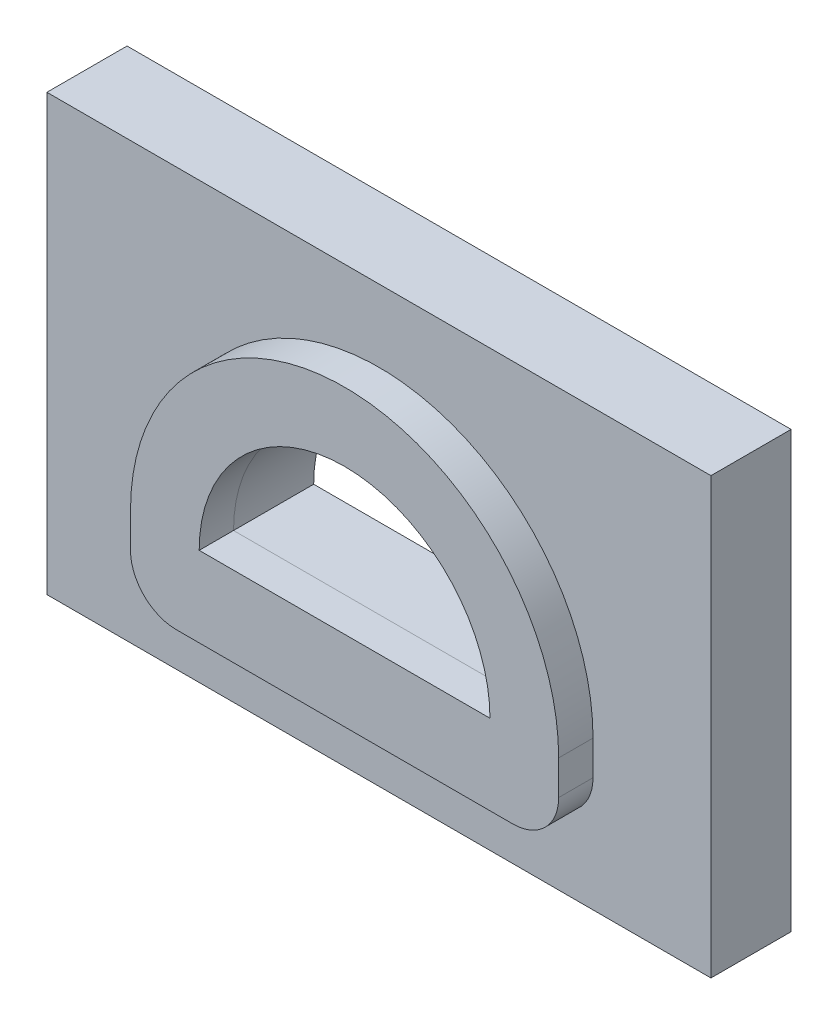
ISO-10303-21;
HEADER;
FILE_DESCRIPTION(('STEP AP214'),'2;1');
FILE_NAME('part.step','',(''),(''),'','','');
FILE_SCHEMA(('AUTOMOTIVE_DESIGN { 1 0 10303 214 1 1 1 1 }'));
ENDSEC;
DATA;
#1=APPLICATION_CONTEXT('core data for automotive mechanical design processes');
#2=APPLICATION_PROTOCOL_DEFINITION('international standard','automotive_design',2000,#1);
#3=PRODUCT_CONTEXT('',#1,'mechanical');
#4=PRODUCT('Part','Part','',(#3));
#5=PRODUCT_RELATED_PRODUCT_CATEGORY('part','',(#4));
#6=PRODUCT_DEFINITION_FORMATION('','',#4);
#7=PRODUCT_DEFINITION_CONTEXT('part definition',#1,'design');
#8=PRODUCT_DEFINITION('design','',#6,#7);
#9=PRODUCT_DEFINITION_SHAPE('','',#8);
#10=(LENGTH_UNIT() NAMED_UNIT(*) SI_UNIT(.MILLI.,.METRE.));
#11=(NAMED_UNIT(*) PLANE_ANGLE_UNIT() SI_UNIT($,.RADIAN.));
#12=(NAMED_UNIT(*) SI_UNIT($,.STERADIAN.) SOLID_ANGLE_UNIT());
#13=UNCERTAINTY_MEASURE_WITH_UNIT(LENGTH_MEASURE(1.E-05),#10,'distance_accuracy_value','');
#14=(GEOMETRIC_REPRESENTATION_CONTEXT(3) GLOBAL_UNCERTAINTY_ASSIGNED_CONTEXT((#13)) GLOBAL_UNIT_ASSIGNED_CONTEXT((#10,
#11,#12)) REPRESENTATION_CONTEXT('',''));
#15=CARTESIAN_POINT('',(0.,0.,0.));
#16=DIRECTION('',(0.,0.,1.));
#17=DIRECTION('',(1.,0.,0.));
#18=AXIS2_PLACEMENT_3D('',#15,#16,#17);
#19=CARTESIAN_POINT('',(2.15,0.,-3.5));
#20=DIRECTION('',(0.,0.,1.));
#21=DIRECTION('',(1.,0.,0.));
#22=AXIS2_PLACEMENT_3D('',#19,#20,#21);
#23=CYLINDRICAL_SURFACE('',#22,6.35);
#24=CARTESIAN_POINT('',(2.15,0.,0.));
#25=DIRECTION('',(0.,0.,1.));
#26=DIRECTION('',(1.,0.,0.));
#27=AXIS2_PLACEMENT_3D('',#24,#25,#26);
#28=CIRCLE('',#27,6.35);
#29=CARTESIAN_POINT('',(8.5,0.,0.));
#30=VERTEX_POINT('',#29);
#31=CARTESIAN_POINT('',(-4.2,0.,0.));
#32=VERTEX_POINT('',#31);
#33=EDGE_CURVE('E140',#30,#32,#28,.T.);
#34=ORIENTED_EDGE('',*,*,#33,.T.);
#35=DIRECTION('',(0.,0.,1.));
#36=VECTOR('',#35,1.);
#37=CARTESIAN_POINT('',(-4.2,0.,-3.5));
#38=LINE('',#37,#36);
#39=CARTESIAN_POINT('',(-4.2,0.,-3.5));
#40=VERTEX_POINT('',#39);
#41=EDGE_CURVE('E12',#40,#32,#38,.T.);
#42=ORIENTED_EDGE('',*,*,#41,.F.);
#43=CARTESIAN_POINT('',(2.15,0.,-3.5));
#44=DIRECTION('',(0.,0.,1.));
#45=DIRECTION('',(1.,0.,0.));
#46=AXIS2_PLACEMENT_3D('',#43,#44,#45);
#47=CIRCLE('',#46,6.35);
#48=CARTESIAN_POINT('',(8.5,0.,-3.5));
#49=VERTEX_POINT('',#48);
#50=EDGE_CURVE('E124',#49,#40,#47,.T.);
#51=ORIENTED_EDGE('',*,*,#50,.F.);
#52=DIRECTION('',(0.,0.,1.));
#53=VECTOR('',#52,1.);
#54=CARTESIAN_POINT('',(8.5,0.,-3.5));
#55=LINE('',#54,#53);
#56=EDGE_CURVE('E55',#49,#30,#55,.T.);
#57=ORIENTED_EDGE('',*,*,#56,.T.);
#58=EDGE_LOOP('',(#34,#42,#51,#57));
#59=FACE_BOUND('',#58,.T.);
#60=ADVANCED_FACE('F45',(#59),#23,.F.);
#61=CARTESIAN_POINT('',(16.65,0.,-3.5));
#62=DIRECTION('',(-1.,0.,0.));
#63=DIRECTION('',(0.,-1.,0.));
#64=AXIS2_PLACEMENT_3D('',#61,#62,#63);
#65=PLANE('',#64);
#66=DIRECTION('',(0.,-1.,0.));
#67=VECTOR('',#66,1.);
#68=CARTESIAN_POINT('',(16.65,0.,0.));
#69=LINE('',#68,#67);
#70=CARTESIAN_POINT('',(16.65,12.5,0.));
#71=VERTEX_POINT('',#70);
#72=CARTESIAN_POINT('',(16.65,-6.5,0.));
#73=VERTEX_POINT('',#72);
#74=EDGE_CURVE('E116',#71,#73,#69,.T.);
#75=ORIENTED_EDGE('',*,*,#74,.T.);
#76=DIRECTION('',(0.,0.,1.));
#77=VECTOR('',#76,1.);
#78=CARTESIAN_POINT('',(16.65,-6.5,-3.5));
#79=LINE('',#78,#77);
#80=CARTESIAN_POINT('',(16.65,-6.5,-3.5));
#81=VERTEX_POINT('',#80);
#82=EDGE_CURVE('E114',#81,#73,#79,.T.);
#83=ORIENTED_EDGE('',*,*,#82,.F.);
#84=DIRECTION('',(0.,-1.,0.));
#85=VECTOR('',#84,1.);
#86=CARTESIAN_POINT('',(16.65,0.,-3.5));
#87=LINE('',#86,#85);
#88=CARTESIAN_POINT('',(16.65,12.5,-3.5));
#89=VERTEX_POINT('',#88);
#90=EDGE_CURVE('E104',#89,#81,#87,.T.);
#91=ORIENTED_EDGE('',*,*,#90,.F.);
#92=DIRECTION('',(0.,0.,1.));
#93=VECTOR('',#92,1.);
#94=CARTESIAN_POINT('',(16.65,12.5,-3.5));
#95=LINE('',#94,#93);
#96=EDGE_CURVE('E49',#89,#71,#95,.T.);
#97=ORIENTED_EDGE('',*,*,#96,.T.);
#98=EDGE_LOOP('',(#75,#83,#91,#97));
#99=FACE_BOUND('',#98,.T.);
#100=ADVANCED_FACE('F47',(#99),#65,.F.);
#101=CARTESIAN_POINT('',(0.,-6.5,-3.5));
#102=DIRECTION('',(0.,-1.,0.));
#103=DIRECTION('',(1.,0.,0.));
#104=AXIS2_PLACEMENT_3D('',#101,#102,#103);
#105=PLANE('',#104);
#106=DIRECTION('',(1.,0.,0.));
#107=VECTOR('',#106,1.);
#108=CARTESIAN_POINT('',(0.,-6.5,0.));
#109=LINE('',#108,#107);
#110=CARTESIAN_POINT('',(-12.35,-6.5,0.));
#111=VERTEX_POINT('',#110);
#112=EDGE_CURVE('E138',#111,#73,#109,.T.);
#113=ORIENTED_EDGE('',*,*,#112,.F.);
#114=DIRECTION('',(0.,0.,1.));
#115=VECTOR('',#114,1.);
#116=CARTESIAN_POINT('',(-12.35,-6.5,-3.5));
#117=LINE('',#116,#115);
#118=CARTESIAN_POINT('',(-12.35,-6.5,-3.5));
#119=VERTEX_POINT('',#118);
#120=EDGE_CURVE('E120',#119,#111,#117,.T.);
#121=ORIENTED_EDGE('',*,*,#120,.F.);
#122=DIRECTION('',(1.,0.,0.));
#123=VECTOR('',#122,1.);
#124=CARTESIAN_POINT('',(0.,-6.5,-3.5));
#125=LINE('',#124,#123);
#126=EDGE_CURVE('E109',#119,#81,#125,.T.);
#127=ORIENTED_EDGE('',*,*,#126,.T.);
#128=ORIENTED_EDGE('',*,*,#82,.T.);
#129=EDGE_LOOP('',(#113,#121,#127,#128));
#130=FACE_BOUND('',#129,.T.);
#131=ADVANCED_FACE('F122',(#130),#105,.T.);
#132=CARTESIAN_POINT('',(-12.35,0.,-3.5));
#133=DIRECTION('',(-1.,0.,0.));
#134=DIRECTION('',(0.,-1.,0.));
#135=AXIS2_PLACEMENT_3D('',#132,#133,#134);
#136=PLANE('',#135);
#137=DIRECTION('',(0.,-1.,0.));
#138=VECTOR('',#137,1.);
#139=CARTESIAN_POINT('',(-12.35,0.,0.));
#140=LINE('',#139,#138);
#141=CARTESIAN_POINT('',(-12.35,12.5,0.));
#142=VERTEX_POINT('',#141);
#143=EDGE_CURVE('E135',#142,#111,#140,.T.);
#144=ORIENTED_EDGE('',*,*,#143,.F.);
#145=DIRECTION('',(0.,0.,1.));
#146=VECTOR('',#145,1.);
#147=CARTESIAN_POINT('',(-12.35,12.5,-3.5));
#148=LINE('',#147,#146);
#149=CARTESIAN_POINT('',(-12.35,12.5,-3.5));
#150=VERTEX_POINT('',#149);
#151=EDGE_CURVE('E145',#150,#142,#148,.T.);
#152=ORIENTED_EDGE('',*,*,#151,.F.);
#153=DIRECTION('',(0.,-1.,0.));
#154=VECTOR('',#153,1.);
#155=CARTESIAN_POINT('',(-12.35,0.,-3.5));
#156=LINE('',#155,#154);
#157=EDGE_CURVE('E125',#150,#119,#156,.T.);
#158=ORIENTED_EDGE('',*,*,#157,.T.);
#159=ORIENTED_EDGE('',*,*,#120,.T.);
#160=EDGE_LOOP('',(#144,#152,#158,#159));
#161=FACE_BOUND('',#160,.T.);
#162=ADVANCED_FACE('F152',(#161),#136,.T.);
#163=CARTESIAN_POINT('',(0.,12.5,-3.5));
#164=DIRECTION('',(0.,-1.,0.));
#165=DIRECTION('',(0.,0.,-1.));
#166=AXIS2_PLACEMENT_3D('',#163,#164,#165);
#167=PLANE('',#166);
#168=DIRECTION('',(1.,0.,0.));
#169=VECTOR('',#168,1.);
#170=CARTESIAN_POINT('',(0.,12.5,0.));
#171=LINE('',#170,#169);
#172=EDGE_CURVE('E133',#142,#71,#171,.T.);
#173=ORIENTED_EDGE('',*,*,#172,.T.);
#174=ORIENTED_EDGE('',*,*,#96,.F.);
#175=DIRECTION('',(1.,0.,0.));
#176=VECTOR('',#175,1.);
#177=CARTESIAN_POINT('',(0.,12.5,-3.5));
#178=LINE('',#177,#176);
#179=EDGE_CURVE('E95',#150,#89,#178,.T.);
#180=ORIENTED_EDGE('',*,*,#179,.F.);
#181=ORIENTED_EDGE('',*,*,#151,.T.);
#182=EDGE_LOOP('',(#173,#174,#180,#181));
#183=FACE_BOUND('',#182,.T.);
#184=ADVANCED_FACE('F153',(#183),#167,.F.);
#185=CARTESIAN_POINT('',(0.,0.,-3.5));
#186=DIRECTION('',(0.,-1.,0.));
#187=DIRECTION('',(0.,0.,-1.));
#188=AXIS2_PLACEMENT_3D('',#185,#186,#187);
#189=PLANE('',#188);
#190=DIRECTION('',(1.,0.,0.));
#191=VECTOR('',#190,1.);
#192=CARTESIAN_POINT('',(0.,0.,0.));
#193=LINE('',#192,#191);
#194=EDGE_CURVE('E83',#32,#30,#193,.T.);
#195=ORIENTED_EDGE('',*,*,#194,.T.);
#196=ORIENTED_EDGE('',*,*,#56,.F.);
#197=DIRECTION('',(1.,0.,0.));
#198=VECTOR('',#197,1.);
#199=CARTESIAN_POINT('',(0.,0.,-3.5));
#200=LINE('',#199,#198);
#201=EDGE_CURVE('E63',#40,#49,#200,.T.);
#202=ORIENTED_EDGE('',*,*,#201,.F.);
#203=ORIENTED_EDGE('',*,*,#41,.T.);
#204=EDGE_LOOP('',(#195,#196,#202,#203));
#205=FACE_BOUND('',#204,.T.);
#206=ADVANCED_FACE('F155',(#205),#189,.F.);
#207=CARTESIAN_POINT('',(0.,0.,-3.5));
#208=DIRECTION('',(0.,0.,1.));
#209=DIRECTION('',(1.,0.,0.));
#210=AXIS2_PLACEMENT_3D('',#207,#208,#209);
#211=PLANE('',#210);
#212=ORIENTED_EDGE('',*,*,#90,.T.);
#213=ORIENTED_EDGE('',*,*,#126,.F.);
#214=ORIENTED_EDGE('',*,*,#157,.F.);
#215=ORIENTED_EDGE('',*,*,#179,.T.);
#216=EDGE_LOOP('',(#212,#213,#214,#215));
#217=FACE_BOUND('',#216,.T.);
#218=ORIENTED_EDGE('',*,*,#50,.T.);
#219=ORIENTED_EDGE('',*,*,#201,.T.);
#220=EDGE_LOOP('',(#218,#219));
#221=FACE_BOUND('',#220,.T.);
#222=ADVANCED_FACE('F106',(#217,#221),#211,.F.);
#223=CARTESIAN_POINT('',(0.,0.,0.));
#224=DIRECTION('',(0.,0.,1.));
#225=DIRECTION('',(1.,0.,0.));
#226=AXIS2_PLACEMENT_3D('',#223,#224,#225);
#227=PLANE('',#226);
#228=ORIENTED_EDGE('',*,*,#74,.F.);
#229=ORIENTED_EDGE('',*,*,#172,.F.);
#230=ORIENTED_EDGE('',*,*,#143,.T.);
#231=ORIENTED_EDGE('',*,*,#112,.T.);
#232=EDGE_LOOP('',(#228,#229,#230,#231));
#233=FACE_BOUND('',#232,.T.);
#234=ORIENTED_EDGE('',*,*,#33,.F.);
#235=ORIENTED_EDGE('',*,*,#194,.F.);
#236=EDGE_LOOP('',(#234,#235));
#237=FACE_BOUND('',#236,.T.);
#238=ADVANCED_FACE('F149',(#233,#237),#227,.T.);
#239=CLOSED_SHELL('',(#60,#100,#131,#162,#184,#206,#222,#238));
#240=MANIFOLD_SOLID_BREP('B2',#239);
#241=CARTESIAN_POINT('',(11.5,0.,1.5));
#242=DIRECTION('',(-1.,0.,0.));
#243=DIRECTION('',(0.,0.,1.));
#244=AXIS2_PLACEMENT_3D('',#241,#242,#243);
#245=PLANE('',#244);
#246=DIRECTION('',(0.,1.,0.));
#247=VECTOR('',#246,1.);
#248=CARTESIAN_POINT('',(11.5,0.,1.5));
#249=LINE('',#248,#247);
#250=CARTESIAN_POINT('',(11.5,-1.5,1.5));
#251=VERTEX_POINT('',#250);
#252=CARTESIAN_POINT('',(11.5,0.,1.5));
#253=VERTEX_POINT('',#252);
#254=EDGE_CURVE('E317',#251,#253,#249,.T.);
#255=ORIENTED_EDGE('',*,*,#254,.F.);
#256=DIRECTION('',(0.,0.,-1.));
#257=VECTOR('',#256,1.);
#258=CARTESIAN_POINT('',(11.5,-1.5,1.5));
#259=LINE('',#258,#257);
#260=CARTESIAN_POINT('',(11.5,-1.5,0.));
#261=VERTEX_POINT('',#260);
#262=EDGE_CURVE('E43',#251,#261,#259,.T.);
#263=ORIENTED_EDGE('',*,*,#262,.T.);
#264=DIRECTION('',(0.,1.,0.));
#265=VECTOR('',#264,1.);
#266=CARTESIAN_POINT('',(11.5,0.,0.));
#267=LINE('',#266,#265);
#268=CARTESIAN_POINT('',(11.5,0.,0.));
#269=VERTEX_POINT('',#268);
#270=EDGE_CURVE('E330',#261,#269,#267,.T.);
#271=ORIENTED_EDGE('',*,*,#270,.T.);
#272=DIRECTION('',(0.,0.,-1.));
#273=VECTOR('',#272,1.);
#274=CARTESIAN_POINT('',(11.5,0.,1.5));
#275=LINE('',#274,#273);
#276=EDGE_CURVE('E340',#253,#269,#275,.T.);
#277=ORIENTED_EDGE('',*,*,#276,.F.);
#278=EDGE_LOOP('',(#255,#263,#271,#277));
#279=FACE_BOUND('',#278,.T.);
#280=ADVANCED_FACE('F229',(#279),#245,.F.);
#281=CARTESIAN_POINT('',(2.15,0.,1.5));
#282=DIRECTION('',(0.,0.,-1.));
#283=DIRECTION('',(-1.,0.,0.));
#284=AXIS2_PLACEMENT_3D('',#281,#282,#283);
#285=CYLINDRICAL_SURFACE('',#284,9.35);
#286=CARTESIAN_POINT('',(2.15,0.,0.));
#287=DIRECTION('',(0.,0.,1.));
#288=DIRECTION('',(1.,0.,0.));
#289=AXIS2_PLACEMENT_3D('',#286,#287,#288);
#290=CIRCLE('',#289,9.35);
#291=CARTESIAN_POINT('',(-7.2,0.,0.));
#292=VERTEX_POINT('',#291);
#293=EDGE_CURVE('E332',#269,#292,#290,.T.);
#294=ORIENTED_EDGE('',*,*,#293,.T.);
#295=DIRECTION('',(0.,0.,-1.));
#296=VECTOR('',#295,1.);
#297=CARTESIAN_POINT('',(-7.2,0.,1.5));
#298=LINE('',#297,#296);
#299=CARTESIAN_POINT('',(-7.2,0.,1.5));
#300=VERTEX_POINT('',#299);
#301=EDGE_CURVE('E308',#300,#292,#298,.T.);
#302=ORIENTED_EDGE('',*,*,#301,.F.);
#303=CARTESIAN_POINT('',(2.15,0.,1.5));
#304=DIRECTION('',(0.,0.,1.));
#305=DIRECTION('',(1.,0.,0.));
#306=AXIS2_PLACEMENT_3D('',#303,#304,#305);
#307=CIRCLE('',#306,9.35);
#308=EDGE_CURVE('E319',#253,#300,#307,.T.);
#309=ORIENTED_EDGE('',*,*,#308,.F.);
#310=ORIENTED_EDGE('',*,*,#276,.T.);
#311=EDGE_LOOP('',(#294,#302,#309,#310));
#312=FACE_BOUND('',#311,.T.);
#313=ADVANCED_FACE('F371',(#312),#285,.T.);
#314=CARTESIAN_POINT('',(-7.2,0.,1.5));
#315=DIRECTION('',(1.,0.,0.));
#316=DIRECTION('',(0.,0.,-1.));
#317=AXIS2_PLACEMENT_3D('',#314,#315,#316);
#318=PLANE('',#317);
#319=DIRECTION('',(0.,-1.,0.));
#320=VECTOR('',#319,1.);
#321=CARTESIAN_POINT('',(-7.2,0.,0.));
#322=LINE('',#321,#320);
#323=CARTESIAN_POINT('',(-7.2,-1.5,0.));
#324=VERTEX_POINT('',#323);
#325=EDGE_CURVE('E334',#292,#324,#322,.T.);
#326=ORIENTED_EDGE('',*,*,#325,.T.);
#327=DIRECTION('',(0.,0.,-1.));
#328=VECTOR('',#327,1.);
#329=CARTESIAN_POINT('',(-7.2,-1.5,1.5));
#330=LINE('',#329,#328);
#331=CARTESIAN_POINT('',(-7.2,-1.5,1.5));
#332=VERTEX_POINT('',#331);
#333=EDGE_CURVE('E252',#324,#332,#330,.F.);
#334=ORIENTED_EDGE('',*,*,#333,.T.);
#335=DIRECTION('',(0.,-1.,0.));
#336=VECTOR('',#335,1.);
#337=CARTESIAN_POINT('',(-7.2,0.,1.5));
#338=LINE('',#337,#336);
#339=EDGE_CURVE('E323',#300,#332,#338,.T.);
#340=ORIENTED_EDGE('',*,*,#339,.F.);
#341=ORIENTED_EDGE('',*,*,#301,.T.);
#342=EDGE_LOOP('',(#326,#334,#340,#341));
#343=FACE_BOUND('',#342,.T.);
#344=ADVANCED_FACE('F367',(#343),#318,.F.);
#345=CARTESIAN_POINT('',(2.15,0.,1.5));
#346=DIRECTION('',(0.,0.,-1.));
#347=DIRECTION('',(-1.,0.,0.));
#348=AXIS2_PLACEMENT_3D('',#345,#346,#347);
#349=CYLINDRICAL_SURFACE('',#348,6.35);
#350=CARTESIAN_POINT('',(2.15,0.,0.));
#351=DIRECTION('',(0.,0.,1.));
#352=DIRECTION('',(1.,0.,0.));
#353=AXIS2_PLACEMENT_3D('',#350,#351,#352);
#354=CIRCLE('',#353,6.35);
#355=CARTESIAN_POINT('',(8.5,0.,0.));
#356=VERTEX_POINT('',#355);
#357=CARTESIAN_POINT('',(-4.2,0.,0.));
#358=VERTEX_POINT('',#357);
#359=EDGE_CURVE('E303',#356,#358,#354,.T.);
#360=ORIENTED_EDGE('',*,*,#359,.F.);
#361=DIRECTION('',(0.,0.,-1.));
#362=VECTOR('',#361,1.);
#363=CARTESIAN_POINT('',(8.5,0.,1.5));
#364=LINE('',#363,#362);
#365=CARTESIAN_POINT('',(8.5,0.,1.5));
#366=VERTEX_POINT('',#365);
#367=EDGE_CURVE('E297',#366,#356,#364,.T.);
#368=ORIENTED_EDGE('',*,*,#367,.F.);
#369=CARTESIAN_POINT('',(2.15,0.,1.5));
#370=DIRECTION('',(0.,0.,1.));
#371=DIRECTION('',(1.,0.,0.));
#372=AXIS2_PLACEMENT_3D('',#369,#370,#371);
#373=CIRCLE('',#372,6.35);
#374=CARTESIAN_POINT('',(-4.2,0.,1.5));
#375=VERTEX_POINT('',#374);
#376=EDGE_CURVE('E300',#366,#375,#373,.T.);
#377=ORIENTED_EDGE('',*,*,#376,.T.);
#378=DIRECTION('',(0.,0.,-1.));
#379=VECTOR('',#378,1.);
#380=CARTESIAN_POINT('',(-4.2,0.,1.5));
#381=LINE('',#380,#379);
#382=EDGE_CURVE('E309',#375,#358,#381,.T.);
#383=ORIENTED_EDGE('',*,*,#382,.T.);
#384=EDGE_LOOP('',(#360,#368,#377,#383));
#385=FACE_BOUND('',#384,.T.);
#386=ADVANCED_FACE('F299',(#385),#349,.F.);
#387=CARTESIAN_POINT('',(0.,0.,1.5));
#388=DIRECTION('',(0.,1.,0.));
#389=DIRECTION('',(0.,0.,1.));
#390=AXIS2_PLACEMENT_3D('',#387,#388,#389);
#391=PLANE('',#390);
#392=DIRECTION('',(1.,0.,0.));
#393=VECTOR('',#392,1.);
#394=CARTESIAN_POINT('',(0.,0.,0.));
#395=LINE('',#394,#393);
#396=EDGE_CURVE('E328',#358,#356,#395,.T.);
#397=ORIENTED_EDGE('',*,*,#396,.F.);
#398=ORIENTED_EDGE('',*,*,#382,.F.);
#399=DIRECTION('',(1.,0.,0.));
#400=VECTOR('',#399,1.);
#401=CARTESIAN_POINT('',(0.,0.,1.5));
#402=LINE('',#401,#400);
#403=EDGE_CURVE('E313',#375,#366,#402,.T.);
#404=ORIENTED_EDGE('',*,*,#403,.T.);
#405=ORIENTED_EDGE('',*,*,#367,.T.);
#406=EDGE_LOOP('',(#397,#398,#404,#405));
#407=FACE_BOUND('',#406,.T.);
#408=ADVANCED_FACE('F316',(#407),#391,.T.);
#409=CARTESIAN_POINT('',(0.,-3.5,1.5));
#410=DIRECTION('',(0.,1.,0.));
#411=DIRECTION('',(0.,0.,1.));
#412=AXIS2_PLACEMENT_3D('',#409,#410,#411);
#413=PLANE('',#412);
#414=DIRECTION('',(1.,0.,0.));
#415=VECTOR('',#414,1.);
#416=CARTESIAN_POINT('',(0.,-3.5,1.5));
#417=LINE('',#416,#415);
#418=CARTESIAN_POINT('',(-5.2,-3.5,1.5));
#419=VERTEX_POINT('',#418);
#420=CARTESIAN_POINT('',(9.5,-3.5,1.5));
#421=VERTEX_POINT('',#420);
#422=EDGE_CURVE('E325',#419,#421,#417,.T.);
#423=ORIENTED_EDGE('',*,*,#422,.F.);
#424=DIRECTION('',(0.,0.,-1.));
#425=VECTOR('',#424,1.);
#426=CARTESIAN_POINT('',(-5.2,-3.5,1.5));
#427=LINE('',#426,#425);
#428=CARTESIAN_POINT('',(-5.2,-3.5,0.));
#429=VERTEX_POINT('',#428);
#430=EDGE_CURVE('E346',#419,#429,#427,.T.);
#431=ORIENTED_EDGE('',*,*,#430,.T.);
#432=DIRECTION('',(1.,0.,0.));
#433=VECTOR('',#432,1.);
#434=CARTESIAN_POINT('',(0.,-3.5,0.));
#435=LINE('',#434,#433);
#436=CARTESIAN_POINT('',(9.5,-3.5,0.));
#437=VERTEX_POINT('',#436);
#438=EDGE_CURVE('E314',#429,#437,#435,.T.);
#439=ORIENTED_EDGE('',*,*,#438,.T.);
#440=DIRECTION('',(0.,0.,-1.));
#441=VECTOR('',#440,1.);
#442=CARTESIAN_POINT('',(9.5,-3.5,1.5));
#443=LINE('',#442,#441);
#444=EDGE_CURVE('E343',#437,#421,#443,.F.);
#445=ORIENTED_EDGE('',*,*,#444,.T.);
#446=EDGE_LOOP('',(#423,#431,#439,#445));
#447=FACE_BOUND('',#446,.T.);
#448=ADVANCED_FACE('F359',(#447),#413,.F.);
#449=CARTESIAN_POINT('',(0.,0.,1.5));
#450=DIRECTION('',(0.,0.,1.));
#451=DIRECTION('',(1.,0.,0.));
#452=AXIS2_PLACEMENT_3D('',#449,#450,#451);
#453=PLANE('',#452);
#454=ORIENTED_EDGE('',*,*,#376,.F.);
#455=ORIENTED_EDGE('',*,*,#403,.F.);
#456=EDGE_LOOP('',(#454,#455));
#457=FACE_BOUND('',#456,.T.);
#458=ORIENTED_EDGE('',*,*,#339,.T.);
#459=CARTESIAN_POINT('',(-5.2,-1.5,1.5));
#460=DIRECTION('',(0.,0.,1.));
#461=DIRECTION('',(1.,0.,0.));
#462=AXIS2_PLACEMENT_3D('',#459,#460,#461);
#463=CIRCLE('',#462,2.);
#464=EDGE_CURVE('E237',#332,#419,#463,.T.);
#465=ORIENTED_EDGE('',*,*,#464,.T.);
#466=ORIENTED_EDGE('',*,*,#422,.T.);
#467=CARTESIAN_POINT('',(9.5,-1.5,1.5));
#468=DIRECTION('',(0.,0.,1.));
#469=DIRECTION('',(1.,0.,0.));
#470=AXIS2_PLACEMENT_3D('',#467,#468,#469);
#471=CIRCLE('',#470,2.);
#472=EDGE_CURVE('E244',#421,#251,#471,.T.);
#473=ORIENTED_EDGE('',*,*,#472,.T.);
#474=ORIENTED_EDGE('',*,*,#254,.T.);
#475=ORIENTED_EDGE('',*,*,#308,.T.);
#476=EDGE_LOOP('',(#458,#465,#466,#473,#474,#475));
#477=FACE_BOUND('',#476,.T.);
#478=ADVANCED_FACE('F312',(#457,#477),#453,.T.);
#479=CARTESIAN_POINT('',(0.,0.,0.));
#480=DIRECTION('',(0.,0.,1.));
#481=DIRECTION('',(1.,0.,0.));
#482=AXIS2_PLACEMENT_3D('',#479,#480,#481);
#483=PLANE('',#482);
#484=ORIENTED_EDGE('',*,*,#359,.T.);
#485=ORIENTED_EDGE('',*,*,#396,.T.);
#486=EDGE_LOOP('',(#484,#485));
#487=FACE_BOUND('',#486,.T.);
#488=ORIENTED_EDGE('',*,*,#438,.F.);
#489=CARTESIAN_POINT('',(-5.2,-1.5,0.));
#490=DIRECTION('',(0.,0.,1.));
#491=DIRECTION('',(1.,0.,0.));
#492=AXIS2_PLACEMENT_3D('',#489,#490,#491);
#493=CIRCLE('',#492,2.);
#494=EDGE_CURVE('E351',#429,#324,#493,.F.);
#495=ORIENTED_EDGE('',*,*,#494,.T.);
#496=ORIENTED_EDGE('',*,*,#325,.F.);
#497=ORIENTED_EDGE('',*,*,#293,.F.);
#498=ORIENTED_EDGE('',*,*,#270,.F.);
#499=CARTESIAN_POINT('',(9.5,-1.5,0.));
#500=DIRECTION('',(0.,0.,1.));
#501=DIRECTION('',(1.,0.,0.));
#502=AXIS2_PLACEMENT_3D('',#499,#500,#501);
#503=CIRCLE('',#502,2.);
#504=EDGE_CURVE('E349',#261,#437,#503,.F.);
#505=ORIENTED_EDGE('',*,*,#504,.T.);
#506=EDGE_LOOP('',(#488,#495,#496,#497,#498,#505));
#507=FACE_BOUND('',#506,.T.);
#508=ADVANCED_FACE('F365',(#487,#507),#483,.F.);
#509=CARTESIAN_POINT('',(-5.2,-1.5,1.5));
#510=DIRECTION('',(0.,0.,-1.));
#511=DIRECTION('',(-1.,0.,0.));
#512=AXIS2_PLACEMENT_3D('',#509,#510,#511);
#513=CYLINDRICAL_SURFACE('',#512,2.);
#514=ORIENTED_EDGE('',*,*,#464,.F.);
#515=ORIENTED_EDGE('',*,*,#333,.F.);
#516=ORIENTED_EDGE('',*,*,#494,.F.);
#517=ORIENTED_EDGE('',*,*,#430,.F.);
#518=EDGE_LOOP('',(#514,#515,#516,#517));
#519=FACE_BOUND('',#518,.T.);
#520=ADVANCED_FACE('F362',(#519),#513,.T.);
#521=CARTESIAN_POINT('',(9.5,-1.5,1.5));
#522=DIRECTION('',(0.,0.,-1.));
#523=DIRECTION('',(-1.,0.,0.));
#524=AXIS2_PLACEMENT_3D('',#521,#522,#523);
#525=CYLINDRICAL_SURFACE('',#524,2.);
#526=ORIENTED_EDGE('',*,*,#472,.F.);
#527=ORIENTED_EDGE('',*,*,#444,.F.);
#528=ORIENTED_EDGE('',*,*,#504,.F.);
#529=ORIENTED_EDGE('',*,*,#262,.F.);
#530=EDGE_LOOP('',(#526,#527,#528,#529));
#531=FACE_BOUND('',#530,.T.);
#532=ADVANCED_FACE('F231',(#531),#525,.T.);
#533=CLOSED_SHELL('',(#280,#313,#344,#386,#408,#448,#478,#508,#520,#532));
#534=MANIFOLD_SOLID_BREP('B6',#533);
#535=ADVANCED_BREP_SHAPE_REPRESENTATION('',(#18,#240,#534),#14);
#536=SHAPE_DEFINITION_REPRESENTATION(#9,#535);
ENDSEC;
END-ISO-10303-21;
